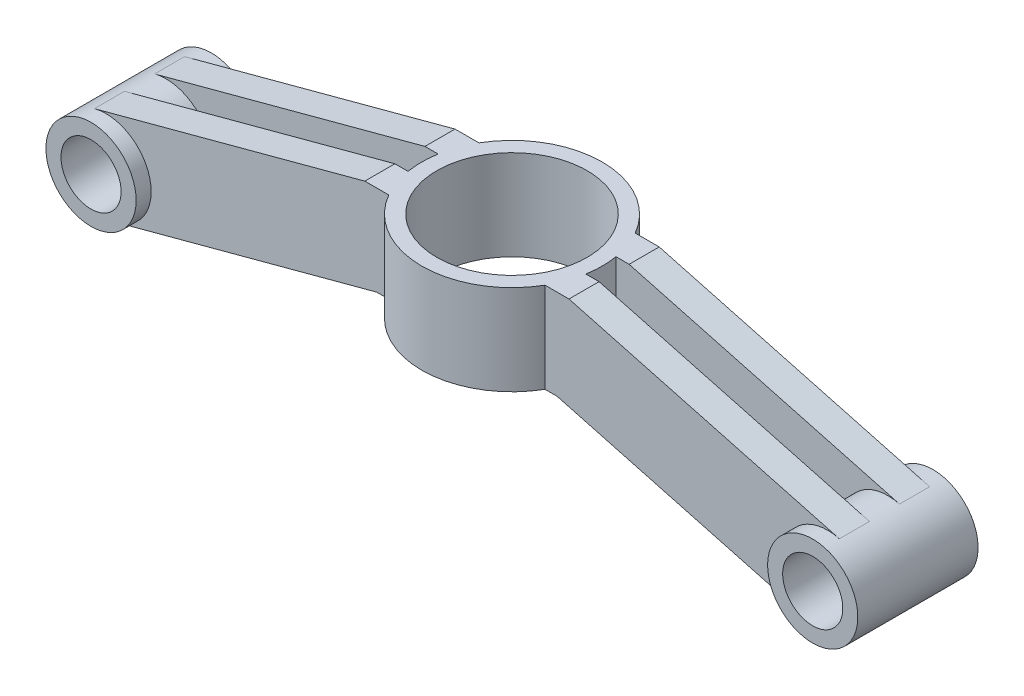
ISO-10303-21;
HEADER;
FILE_DESCRIPTION(('STEP AP214'),'2;1');
FILE_NAME('part.step','',(''),(''),'','','');
FILE_SCHEMA(('AUTOMOTIVE_DESIGN { 1 0 10303 214 1 1 1 1 }'));
ENDSEC;
DATA;
#1=APPLICATION_CONTEXT('core data for automotive mechanical design processes');
#2=APPLICATION_PROTOCOL_DEFINITION('international standard','automotive_design',2000,#1);
#3=PRODUCT_CONTEXT('',#1,'mechanical');
#4=PRODUCT('Part','Part','',(#3));
#5=PRODUCT_RELATED_PRODUCT_CATEGORY('part','',(#4));
#6=PRODUCT_DEFINITION_FORMATION('','',#4);
#7=PRODUCT_DEFINITION_CONTEXT('part definition',#1,'design');
#8=PRODUCT_DEFINITION('design','',#6,#7);
#9=PRODUCT_DEFINITION_SHAPE('','',#8);
#10=(LENGTH_UNIT() NAMED_UNIT(*) SI_UNIT(.MILLI.,.METRE.));
#11=(NAMED_UNIT(*) PLANE_ANGLE_UNIT() SI_UNIT($,.RADIAN.));
#12=(NAMED_UNIT(*) SI_UNIT($,.STERADIAN.) SOLID_ANGLE_UNIT());
#13=UNCERTAINTY_MEASURE_WITH_UNIT(LENGTH_MEASURE(1.E-05),#10,'distance_accuracy_value','');
#14=(GEOMETRIC_REPRESENTATION_CONTEXT(3) GLOBAL_UNCERTAINTY_ASSIGNED_CONTEXT((#13)) GLOBAL_UNIT_ASSIGNED_CONTEXT((#10,
#11,#12)) REPRESENTATION_CONTEXT('',''));
#15=CARTESIAN_POINT('',(0.,0.,0.));
#16=DIRECTION('',(0.,0.,1.));
#17=DIRECTION('',(1.,0.,0.));
#18=AXIS2_PLACEMENT_3D('',#15,#16,#17);
#19=CARTESIAN_POINT('',(0.,38.5862846126499,-15.));
#20=DIRECTION('',(0.,1.,0.));
#21=DIRECTION('',(0.,0.,1.));
#22=AXIS2_PLACEMENT_3D('',#19,#20,#21);
#23=PLANE('',#22);
#24=DIRECTION('',(-1.,0.,0.));
#25=VECTOR('',#24,1.);
#26=CARTESIAN_POINT('',(0.,38.5862846126499,-5.));
#27=LINE('',#26,#25);
#28=CARTESIAN_POINT('',(-25.9807621135332,38.5862846126499,-5.));
#29=VERTEX_POINT('',#28);
#30=CARTESIAN_POINT('',(-33.9495749276219,38.5862846126499,-5.));
#31=VERTEX_POINT('',#30);
#32=EDGE_CURVE('E222',#29,#31,#27,.T.);
#33=ORIENTED_EDGE('',*,*,#32,.F.);
#34=CARTESIAN_POINT('',(0.,38.5862846126499,-20.));
#35=DIRECTION('',(0.,1.,0.));
#36=DIRECTION('',(0.,0.,1.));
#37=AXIS2_PLACEMENT_3D('',#34,#35,#36);
#38=CIRCLE('',#37,30.);
#39=CARTESIAN_POINT('',(25.9807621135332,38.5862846126499,-5.));
#40=VERTEX_POINT('',#39);
#41=EDGE_CURVE('E205',#29,#40,#38,.T.);
#42=ORIENTED_EDGE('',*,*,#41,.T.);
#43=CARTESIAN_POINT('',(33.9495749276219,38.5862846126499,-5.));
#44=VERTEX_POINT('',#43);
#45=EDGE_CURVE('E219',#44,#40,#27,.T.);
#46=ORIENTED_EDGE('',*,*,#45,.F.);
#47=DIRECTION('',(0.,0.,1.));
#48=VECTOR('',#47,1.);
#49=CARTESIAN_POINT('',(33.9495749276219,38.5862846126499,-15.));
#50=LINE('',#49,#48);
#51=CARTESIAN_POINT('',(33.9495749276219,38.5862846126499,-15.));
#52=VERTEX_POINT('',#51);
#53=EDGE_CURVE('E375',#52,#44,#50,.T.);
#54=ORIENTED_EDGE('',*,*,#53,.F.);
#55=DIRECTION('',(-1.,0.,0.));
#56=VECTOR('',#55,1.);
#57=CARTESIAN_POINT('',(0.,38.5862846126499,-15.));
#58=LINE('',#57,#56);
#59=CARTESIAN_POINT('',(29.5803989154981,38.5862846126499,-15.));
#60=VERTEX_POINT('',#59);
#61=EDGE_CURVE('E342',#52,#60,#58,.T.);
#62=ORIENTED_EDGE('',*,*,#61,.T.);
#63=CARTESIAN_POINT('',(29.5803989154981,38.5862846126499,-25.));
#64=VERTEX_POINT('',#63);
#65=EDGE_CURVE('E227',#60,#64,#38,.T.);
#66=ORIENTED_EDGE('',*,*,#65,.T.);
#67=DIRECTION('',(-1.,0.,0.));
#68=VECTOR('',#67,1.);
#69=CARTESIAN_POINT('',(0.,38.5862846126499,-25.));
#70=LINE('',#69,#68);
#71=CARTESIAN_POINT('',(33.9495749276219,38.5862846126499,-25.));
#72=VERTEX_POINT('',#71);
#73=EDGE_CURVE('E316',#72,#64,#70,.T.);
#74=ORIENTED_EDGE('',*,*,#73,.F.);
#75=DIRECTION('',(0.,0.,1.));
#76=VECTOR('',#75,1.);
#77=CARTESIAN_POINT('',(33.9495749276219,38.5862846126499,-35.));
#78=LINE('',#77,#76);
#79=CARTESIAN_POINT('',(33.9495749276219,38.5862846126499,-35.));
#80=VERTEX_POINT('',#79);
#81=EDGE_CURVE('E494',#80,#72,#78,.T.);
#82=ORIENTED_EDGE('',*,*,#81,.F.);
#83=DIRECTION('',(-1.,0.,0.));
#84=VECTOR('',#83,1.);
#85=CARTESIAN_POINT('',(0.,38.5862846126499,-35.));
#86=LINE('',#85,#84);
#87=CARTESIAN_POINT('',(25.9807621135332,38.5862846126499,-35.));
#88=VERTEX_POINT('',#87);
#89=EDGE_CURVE('E423',#80,#88,#86,.T.);
#90=ORIENTED_EDGE('',*,*,#89,.T.);
#91=CARTESIAN_POINT('',(-25.9807621135332,38.5862846126499,-35.));
#92=VERTEX_POINT('',#91);
#93=EDGE_CURVE('E537',#88,#92,#38,.T.);
#94=ORIENTED_EDGE('',*,*,#93,.T.);
#95=CARTESIAN_POINT('',(-33.9495749276219,38.5862846126499,-35.));
#96=VERTEX_POINT('',#95);
#97=EDGE_CURVE('E422',#92,#96,#86,.T.);
#98=ORIENTED_EDGE('',*,*,#97,.T.);
#99=DIRECTION('',(0.,0.,1.));
#100=VECTOR('',#99,1.);
#101=CARTESIAN_POINT('',(-33.9495749276219,38.5862846126499,-35.));
#102=LINE('',#101,#100);
#103=CARTESIAN_POINT('',(-33.9495749276219,38.5862846126499,-25.));
#104=VERTEX_POINT('',#103);
#105=EDGE_CURVE('E331',#96,#104,#102,.T.);
#106=ORIENTED_EDGE('',*,*,#105,.T.);
#107=CARTESIAN_POINT('',(-29.5803989154981,38.5862846126499,-25.));
#108=VERTEX_POINT('',#107);
#109=EDGE_CURVE('E311',#108,#104,#70,.T.);
#110=ORIENTED_EDGE('',*,*,#109,.F.);
#111=CARTESIAN_POINT('',(-29.5803989154981,38.5862846126499,-15.));
#112=VERTEX_POINT('',#111);
#113=EDGE_CURVE('E224',#108,#112,#38,.T.);
#114=ORIENTED_EDGE('',*,*,#113,.T.);
#115=CARTESIAN_POINT('',(-33.9495749276219,38.5862846126499,-15.));
#116=VERTEX_POINT('',#115);
#117=EDGE_CURVE('E257',#112,#116,#58,.T.);
#118=ORIENTED_EDGE('',*,*,#117,.T.);
#119=DIRECTION('',(0.,0.,1.));
#120=VECTOR('',#119,1.);
#121=CARTESIAN_POINT('',(-33.9495749276219,38.5862846126499,-15.));
#122=LINE('',#121,#120);
#123=EDGE_CURVE('E269',#116,#31,#122,.T.);
#124=ORIENTED_EDGE('',*,*,#123,.T.);
#125=EDGE_LOOP('',(#33,#42,#46,#54,#62,#66,#74,#82,#90,#94,#98,#106,#110,#114,#118,#124));
#126=FACE_BOUND('',#125,.T.);
#127=CARTESIAN_POINT('',(0.,38.5862846126499,-20.));
#128=DIRECTION('',(0.,1.,0.));
#129=DIRECTION('',(0.,0.,1.));
#130=AXIS2_PLACEMENT_3D('',#127,#128,#129);
#131=CIRCLE('',#130,25.);
#132=CARTESIAN_POINT('',(0.,38.5862846126499,5.));
#133=VERTEX_POINT('',#132);
#134=EDGE_CURVE('E539',#133,#133,#131,.T.);
#135=ORIENTED_EDGE('',*,*,#134,.F.);
#136=EDGE_LOOP('',(#135));
#137=FACE_BOUND('',#136,.T.);
#138=ADVANCED_FACE('F41',(#126,#137),#23,.T.);
#139=CARTESIAN_POINT('',(0.,8.58628461264989,-15.));
#140=DIRECTION('',(0.,-1.,0.));
#141=DIRECTION('',(1.,0.,0.));
#142=AXIS2_PLACEMENT_3D('',#139,#140,#141);
#143=PLANE('',#142);
#144=DIRECTION('',(1.,0.,0.));
#145=VECTOR('',#144,1.);
#146=CARTESIAN_POINT('',(0.,8.58628461264989,-15.));
#147=LINE('',#146,#145);
#148=CARTESIAN_POINT('',(-30.,8.58628461264989,-15.));
#149=VERTEX_POINT('',#148);
#150=CARTESIAN_POINT('',(-29.5803989154981,8.58628461264989,-15.));
#151=VERTEX_POINT('',#150);
#152=EDGE_CURVE('E242',#149,#151,#147,.T.);
#153=ORIENTED_EDGE('',*,*,#152,.T.);
#154=CARTESIAN_POINT('',(0.,8.58628461264989,-20.));
#155=DIRECTION('',(0.,1.,0.));
#156=DIRECTION('',(0.,0.,1.));
#157=AXIS2_PLACEMENT_3D('',#154,#155,#156);
#158=CIRCLE('',#157,30.);
#159=CARTESIAN_POINT('',(-29.5803989154981,8.58628461264989,-25.));
#160=VERTEX_POINT('',#159);
#161=EDGE_CURVE('E292',#160,#151,#158,.T.);
#162=ORIENTED_EDGE('',*,*,#161,.F.);
#163=DIRECTION('',(1.,0.,0.));
#164=VECTOR('',#163,1.);
#165=CARTESIAN_POINT('',(-30.,8.58628461264989,-25.));
#166=LINE('',#165,#164);
#167=CARTESIAN_POINT('',(-30.,8.58628461264989,-25.));
#168=VERTEX_POINT('',#167);
#169=EDGE_CURVE('E301',#168,#160,#166,.T.);
#170=ORIENTED_EDGE('',*,*,#169,.F.);
#171=DIRECTION('',(0.,0.,1.));
#172=VECTOR('',#171,1.);
#173=CARTESIAN_POINT('',(-30.,8.58628461264989,-35.));
#174=LINE('',#173,#172);
#175=CARTESIAN_POINT('',(-30.,8.58628461264989,-35.));
#176=VERTEX_POINT('',#175);
#177=EDGE_CURVE('E335',#176,#168,#174,.T.);
#178=ORIENTED_EDGE('',*,*,#177,.F.);
#179=DIRECTION('',(1.,0.,0.));
#180=VECTOR('',#179,1.);
#181=CARTESIAN_POINT('',(-30.,8.58628461264989,-35.));
#182=LINE('',#181,#180);
#183=CARTESIAN_POINT('',(-25.9807621135332,8.58628461264989,-35.));
#184=VERTEX_POINT('',#183);
#185=EDGE_CURVE('E418',#176,#184,#182,.T.);
#186=ORIENTED_EDGE('',*,*,#185,.T.);
#187=CARTESIAN_POINT('',(25.9807621135332,8.58628461264989,-35.));
#188=VERTEX_POINT('',#187);
#189=EDGE_CURVE('E304',#188,#184,#158,.T.);
#190=ORIENTED_EDGE('',*,*,#189,.F.);
#191=CARTESIAN_POINT('',(30.,8.58628461264989,-35.));
#192=VERTEX_POINT('',#191);
#193=EDGE_CURVE('E417',#188,#192,#182,.T.);
#194=ORIENTED_EDGE('',*,*,#193,.T.);
#195=DIRECTION('',(0.,0.,1.));
#196=VECTOR('',#195,1.);
#197=CARTESIAN_POINT('',(30.,8.58628461264989,-35.));
#198=LINE('',#197,#196);
#199=CARTESIAN_POINT('',(30.,8.58628461264989,-25.));
#200=VERTEX_POINT('',#199);
#201=EDGE_CURVE('E498',#192,#200,#198,.T.);
#202=ORIENTED_EDGE('',*,*,#201,.T.);
#203=CARTESIAN_POINT('',(29.5803989154981,8.58628461264989,-25.));
#204=VERTEX_POINT('',#203);
#205=EDGE_CURVE('E312',#204,#200,#166,.T.);
#206=ORIENTED_EDGE('',*,*,#205,.F.);
#207=CARTESIAN_POINT('',(29.5803989154981,8.58628461264989,-15.));
#208=VERTEX_POINT('',#207);
#209=EDGE_CURVE('E365',#208,#204,#158,.T.);
#210=ORIENTED_EDGE('',*,*,#209,.F.);
#211=CARTESIAN_POINT('',(30.,8.58628461264989,-15.));
#212=VERTEX_POINT('',#211);
#213=EDGE_CURVE('E57',#208,#212,#147,.T.);
#214=ORIENTED_EDGE('',*,*,#213,.T.);
#215=DIRECTION('',(0.,0.,1.));
#216=VECTOR('',#215,1.);
#217=CARTESIAN_POINT('',(30.,8.58628461264989,-15.));
#218=LINE('',#217,#216);
#219=CARTESIAN_POINT('',(30.,8.58628461264989,-5.));
#220=VERTEX_POINT('',#219);
#221=EDGE_CURVE('E363',#212,#220,#218,.T.);
#222=ORIENTED_EDGE('',*,*,#221,.T.);
#223=DIRECTION('',(1.,0.,0.));
#224=VECTOR('',#223,1.);
#225=CARTESIAN_POINT('',(0.,8.58628461264989,-5.));
#226=LINE('',#225,#224);
#227=CARTESIAN_POINT('',(25.9807621135332,8.58628461264989,-5.));
#228=VERTEX_POINT('',#227);
#229=EDGE_CURVE('E252',#228,#220,#226,.T.);
#230=ORIENTED_EDGE('',*,*,#229,.F.);
#231=CARTESIAN_POINT('',(-25.9807621135332,8.58628461264989,-5.));
#232=VERTEX_POINT('',#231);
#233=EDGE_CURVE('E208',#232,#228,#158,.T.);
#234=ORIENTED_EDGE('',*,*,#233,.F.);
#235=CARTESIAN_POINT('',(-30.,8.58628461264989,-5.));
#236=VERTEX_POINT('',#235);
#237=EDGE_CURVE('E253',#236,#232,#226,.T.);
#238=ORIENTED_EDGE('',*,*,#237,.F.);
#239=DIRECTION('',(0.,0.,1.));
#240=VECTOR('',#239,1.);
#241=CARTESIAN_POINT('',(-30.,8.58628461264989,-15.));
#242=LINE('',#241,#240);
#243=EDGE_CURVE('E258',#149,#236,#242,.T.);
#244=ORIENTED_EDGE('',*,*,#243,.F.);
#245=EDGE_LOOP('',(#153,#162,#170,#178,#186,#190,#194,#202,#206,#210,#214,#222,#230,#234,#238,#244));
#246=FACE_BOUND('',#245,.T.);
#247=CARTESIAN_POINT('',(0.,8.58628461264989,-20.));
#248=DIRECTION('',(0.,1.,0.));
#249=DIRECTION('',(0.,0.,1.));
#250=AXIS2_PLACEMENT_3D('',#247,#248,#249);
#251=CIRCLE('',#250,25.);
#252=CARTESIAN_POINT('',(0.,8.58628461264989,5.));
#253=VERTEX_POINT('',#252);
#254=EDGE_CURVE('E225',#253,#253,#251,.T.);
#255=ORIENTED_EDGE('',*,*,#254,.T.);
#256=EDGE_LOOP('',(#255));
#257=FACE_BOUND('',#256,.T.);
#258=ADVANCED_FACE('F299',(#246,#257),#143,.T.);
#259=CARTESIAN_POINT('',(-120.,0.,-15.));
#260=DIRECTION('',(0.,0.,1.));
#261=DIRECTION('',(1.,0.,0.));
#262=AXIS2_PLACEMENT_3D('',#259,#260,#261);
#263=PLANE('',#262);
#264=ORIENTED_EDGE('',*,*,#213,.F.);
#265=DIRECTION('',(0.,1.,0.));
#266=VECTOR('',#265,1.);
#267=CARTESIAN_POINT('',(29.5803989154981,8.58628461264989,-15.));
#268=LINE('',#267,#266);
#269=EDGE_CURVE('E464',#208,#60,#268,.T.);
#270=ORIENTED_EDGE('',*,*,#269,.T.);
#271=ORIENTED_EDGE('',*,*,#61,.F.);
#272=DIRECTION('',(0.965925826289068,-0.258819045102522,0.));
#273=VECTOR('',#272,1.);
#274=CARTESIAN_POINT('',(33.9495749276219,38.5862846126499,-15.));
#275=LINE('',#274,#273);
#276=CARTESIAN_POINT('',(123.882285676538,14.488887394336,-15.));
#277=VERTEX_POINT('',#276);
#278=EDGE_CURVE('E505',#52,#277,#275,.T.);
#279=ORIENTED_EDGE('',*,*,#278,.T.);
#280=CARTESIAN_POINT('',(120.,0.,-15.));
#281=DIRECTION('',(0.,0.,1.));
#282=DIRECTION('',(-1.,0.,0.));
#283=AXIS2_PLACEMENT_3D('',#280,#281,#282);
#284=CIRCLE('',#283,15.);
#285=CARTESIAN_POINT('',(116.117714323462,-14.488887394336,-15.));
#286=VERTEX_POINT('',#285);
#287=EDGE_CURVE('E370',#277,#286,#284,.T.);
#288=ORIENTED_EDGE('',*,*,#287,.T.);
#289=DIRECTION('',(-0.965925826289068,0.258819045102522,0.));
#290=VECTOR('',#289,1.);
#291=CARTESIAN_POINT('',(30.,8.58628461264989,-15.));
#292=LINE('',#291,#290);
#293=EDGE_CURVE('E367',#286,#212,#292,.T.);
#294=ORIENTED_EDGE('',*,*,#293,.T.);
#295=EDGE_LOOP('',(#264,#270,#271,#279,#288,#294));
#296=FACE_BOUND('',#295,.T.);
#297=ADVANCED_FACE('F368',(#296),#263,.F.);
#298=CARTESIAN_POINT('',(-120.,0.,-5.));
#299=DIRECTION('',(0.,0.,1.));
#300=DIRECTION('',(1.,0.,0.));
#301=AXIS2_PLACEMENT_3D('',#298,#299,#300);
#302=PLANE('',#301);
#303=DIRECTION('',(0.,1.,0.));
#304=VECTOR('',#303,1.);
#305=CARTESIAN_POINT('',(25.9807621135332,8.58628461264989,-5.));
#306=LINE('',#305,#304);
#307=EDGE_CURVE('E202',#228,#40,#306,.T.);
#308=ORIENTED_EDGE('',*,*,#307,.F.);
#309=ORIENTED_EDGE('',*,*,#229,.T.);
#310=DIRECTION('',(-0.965925826289068,0.258819045102522,0.));
#311=VECTOR('',#310,1.);
#312=CARTESIAN_POINT('',(30.,8.58628461264989,-5.));
#313=LINE('',#312,#311);
#314=CARTESIAN_POINT('',(116.117714323462,-14.488887394336,-5.));
#315=VERTEX_POINT('',#314);
#316=EDGE_CURVE('E379',#315,#220,#313,.T.);
#317=ORIENTED_EDGE('',*,*,#316,.F.);
#318=CARTESIAN_POINT('',(120.,0.,-5.));
#319=DIRECTION('',(0.,0.,1.));
#320=DIRECTION('',(-1.,0.,0.));
#321=AXIS2_PLACEMENT_3D('',#318,#319,#320);
#322=CIRCLE('',#321,15.);
#323=CARTESIAN_POINT('',(123.882285676538,14.488887394336,-5.));
#324=VERTEX_POINT('',#323);
#325=EDGE_CURVE('E511',#324,#315,#322,.T.);
#326=ORIENTED_EDGE('',*,*,#325,.F.);
#327=DIRECTION('',(0.965925826289068,-0.258819045102522,0.));
#328=VECTOR('',#327,1.);
#329=CARTESIAN_POINT('',(33.9495749276219,38.5862846126499,-5.));
#330=LINE('',#329,#328);
#331=EDGE_CURVE('E230',#44,#324,#330,.T.);
#332=ORIENTED_EDGE('',*,*,#331,.F.);
#333=ORIENTED_EDGE('',*,*,#45,.T.);
#334=EDGE_LOOP('',(#308,#309,#317,#326,#332,#333));
#335=FACE_BOUND('',#334,.T.);
#336=ADVANCED_FACE('F228',(#335),#302,.T.);
#337=CARTESIAN_POINT('',(-120.,0.,-35.));
#338=DIRECTION('',(0.,0.,1.));
#339=DIRECTION('',(1.,0.,0.));
#340=AXIS2_PLACEMENT_3D('',#337,#338,#339);
#341=PLANE('',#340);
#342=ORIENTED_EDGE('',*,*,#193,.F.);
#343=DIRECTION('',(0.,1.,0.));
#344=VECTOR('',#343,1.);
#345=CARTESIAN_POINT('',(25.9807621135332,8.58628461264989,-35.));
#346=LINE('',#345,#344);
#347=EDGE_CURVE('E454',#188,#88,#346,.T.);
#348=ORIENTED_EDGE('',*,*,#347,.T.);
#349=ORIENTED_EDGE('',*,*,#89,.F.);
#350=DIRECTION('',(0.965925826289068,-0.258819045102522,0.));
#351=VECTOR('',#350,1.);
#352=CARTESIAN_POINT('',(33.9495749276219,38.5862846126499,-35.));
#353=LINE('',#352,#351);
#354=CARTESIAN_POINT('',(123.882285676538,14.488887394336,-35.));
#355=VERTEX_POINT('',#354);
#356=EDGE_CURVE('E477',#80,#355,#353,.T.);
#357=ORIENTED_EDGE('',*,*,#356,.T.);
#358=CARTESIAN_POINT('',(120.,0.,-35.));
#359=DIRECTION('',(0.,0.,1.));
#360=DIRECTION('',(-1.,0.,0.));
#361=AXIS2_PLACEMENT_3D('',#358,#359,#360);
#362=CIRCLE('',#361,15.);
#363=CARTESIAN_POINT('',(116.117714323462,-14.488887394336,-35.));
#364=VERTEX_POINT('',#363);
#365=EDGE_CURVE('E468',#355,#364,#362,.T.);
#366=ORIENTED_EDGE('',*,*,#365,.T.);
#367=DIRECTION('',(-0.965925826289068,0.258819045102522,0.));
#368=VECTOR('',#367,1.);
#369=CARTESIAN_POINT('',(116.117714323462,-14.488887394336,-35.));
#370=LINE('',#369,#368);
#371=EDGE_CURVE('E472',#364,#192,#370,.T.);
#372=ORIENTED_EDGE('',*,*,#371,.T.);
#373=EDGE_LOOP('',(#342,#348,#349,#357,#366,#372));
#374=FACE_BOUND('',#373,.T.);
#375=ADVANCED_FACE('F580',(#374),#341,.F.);
#376=CARTESIAN_POINT('',(-120.,0.,-25.));
#377=DIRECTION('',(0.,0.,1.));
#378=DIRECTION('',(1.,0.,0.));
#379=AXIS2_PLACEMENT_3D('',#376,#377,#378);
#380=PLANE('',#379);
#381=DIRECTION('',(0.,1.,0.));
#382=VECTOR('',#381,1.);
#383=CARTESIAN_POINT('',(29.5803989154981,8.58628461264989,-25.));
#384=LINE('',#383,#382);
#385=EDGE_CURVE('E11',#204,#64,#384,.T.);
#386=ORIENTED_EDGE('',*,*,#385,.F.);
#387=ORIENTED_EDGE('',*,*,#205,.T.);
#388=DIRECTION('',(-0.965925826289068,0.258819045102522,0.));
#389=VECTOR('',#388,1.);
#390=CARTESIAN_POINT('',(116.117714323462,-14.488887394336,-25.));
#391=LINE('',#390,#389);
#392=CARTESIAN_POINT('',(116.117714323462,-14.488887394336,-25.));
#393=VERTEX_POINT('',#392);
#394=EDGE_CURVE('E484',#393,#200,#391,.T.);
#395=ORIENTED_EDGE('',*,*,#394,.F.);
#396=CARTESIAN_POINT('',(120.,0.,-25.));
#397=DIRECTION('',(0.,0.,1.));
#398=DIRECTION('',(-1.,0.,0.));
#399=AXIS2_PLACEMENT_3D('',#396,#397,#398);
#400=CIRCLE('',#399,15.);
#401=CARTESIAN_POINT('',(123.882285676538,14.488887394336,-25.));
#402=VERTEX_POINT('',#401);
#403=EDGE_CURVE('E467',#402,#393,#400,.T.);
#404=ORIENTED_EDGE('',*,*,#403,.F.);
#405=DIRECTION('',(0.965925826289068,-0.258819045102522,0.));
#406=VECTOR('',#405,1.);
#407=CARTESIAN_POINT('',(33.9495749276219,38.5862846126499,-25.));
#408=LINE('',#407,#406);
#409=EDGE_CURVE('E473',#72,#402,#408,.T.);
#410=ORIENTED_EDGE('',*,*,#409,.F.);
#411=ORIENTED_EDGE('',*,*,#73,.T.);
#412=EDGE_LOOP('',(#386,#387,#395,#404,#410,#411));
#413=FACE_BOUND('',#412,.T.);
#414=ADVANCED_FACE('F571',(#413),#380,.T.);
#415=CARTESIAN_POINT('',(-120.,0.,-40.));
#416=DIRECTION('',(0.,0.,1.));
#417=DIRECTION('',(1.,0.,0.));
#418=AXIS2_PLACEMENT_3D('',#415,#416,#417);
#419=CYLINDRICAL_SURFACE('',#418,15.);
#420=CARTESIAN_POINT('',(-120.,0.,-40.));
#421=DIRECTION('',(0.,0.,1.));
#422=DIRECTION('',(1.,0.,0.));
#423=AXIS2_PLACEMENT_3D('',#420,#421,#422);
#424=CIRCLE('',#423,15.);
#425=CARTESIAN_POINT('',(-105.,0.,-40.));
#426=VERTEX_POINT('',#425);
#427=EDGE_CURVE('E276',#426,#426,#424,.T.);
#428=ORIENTED_EDGE('',*,*,#427,.T.);
#429=EDGE_LOOP('',(#428));
#430=FACE_BOUND('',#429,.T.);
#431=CARTESIAN_POINT('',(-120.,0.,0.));
#432=DIRECTION('',(0.,0.,1.));
#433=DIRECTION('',(1.,0.,0.));
#434=AXIS2_PLACEMENT_3D('',#431,#432,#433);
#435=CIRCLE('',#434,15.);
#436=CARTESIAN_POINT('',(-105.,0.,0.));
#437=VERTEX_POINT('',#436);
#438=EDGE_CURVE('E277',#437,#437,#435,.T.);
#439=ORIENTED_EDGE('',*,*,#438,.F.);
#440=EDGE_LOOP('',(#439));
#441=FACE_BOUND('',#440,.T.);
#442=DIRECTION('',(0.,0.,1.));
#443=VECTOR('',#442,1.);
#444=CARTESIAN_POINT('',(-123.882285676538,14.488887394336,-15.));
#445=LINE('',#444,#443);
#446=CARTESIAN_POINT('',(-123.882285676538,14.488887394336,-15.));
#447=VERTEX_POINT('',#446);
#448=CARTESIAN_POINT('',(-123.882285676538,14.488887394336,-5.));
#449=VERTEX_POINT('',#448);
#450=EDGE_CURVE('E265',#447,#449,#445,.T.);
#451=ORIENTED_EDGE('',*,*,#450,.F.);
#452=CARTESIAN_POINT('',(-120.,0.,-15.));
#453=DIRECTION('',(0.,0.,-1.));
#454=DIRECTION('',(1.,0.,0.));
#455=AXIS2_PLACEMENT_3D('',#452,#453,#454);
#456=CIRCLE('',#455,15.);
#457=CARTESIAN_POINT('',(-116.117714323462,-14.488887394336,-15.));
#458=VERTEX_POINT('',#457);
#459=EDGE_CURVE('E350',#447,#458,#456,.T.);
#460=ORIENTED_EDGE('',*,*,#459,.T.);
#461=DIRECTION('',(0.,0.,1.));
#462=VECTOR('',#461,1.);
#463=CARTESIAN_POINT('',(-116.117714323462,-14.488887394336,-15.));
#464=LINE('',#463,#462);
#465=CARTESIAN_POINT('',(-116.117714323462,-14.488887394336,-5.));
#466=VERTEX_POINT('',#465);
#467=EDGE_CURVE('E262',#458,#466,#464,.T.);
#468=ORIENTED_EDGE('',*,*,#467,.T.);
#469=CARTESIAN_POINT('',(-120.,0.,-5.));
#470=DIRECTION('',(0.,0.,-1.));
#471=DIRECTION('',(1.,0.,0.));
#472=AXIS2_PLACEMENT_3D('',#469,#470,#471);
#473=CIRCLE('',#472,15.);
#474=EDGE_CURVE('E238',#449,#466,#473,.T.);
#475=ORIENTED_EDGE('',*,*,#474,.F.);
#476=EDGE_LOOP('',(#451,#460,#468,#475));
#477=FACE_BOUND('',#476,.T.);
#478=DIRECTION('',(0.,0.,1.));
#479=VECTOR('',#478,1.);
#480=CARTESIAN_POINT('',(-123.882285676538,14.488887394336,-35.));
#481=LINE('',#480,#479);
#482=CARTESIAN_POINT('',(-123.882285676538,14.488887394336,-35.));
#483=VERTEX_POINT('',#482);
#484=CARTESIAN_POINT('',(-123.882285676538,14.488887394336,-25.));
#485=VERTEX_POINT('',#484);
#486=EDGE_CURVE('E240',#483,#485,#481,.T.);
#487=ORIENTED_EDGE('',*,*,#486,.F.);
#488=CARTESIAN_POINT('',(-120.,0.,-35.));
#489=DIRECTION('',(0.,0.,-1.));
#490=DIRECTION('',(1.,0.,0.));
#491=AXIS2_PLACEMENT_3D('',#488,#489,#490);
#492=CIRCLE('',#491,15.);
#493=CARTESIAN_POINT('',(-116.117714323462,-14.488887394336,-35.));
#494=VERTEX_POINT('',#493);
#495=EDGE_CURVE('E327',#483,#494,#492,.T.);
#496=ORIENTED_EDGE('',*,*,#495,.T.);
#497=DIRECTION('',(0.,0.,1.));
#498=VECTOR('',#497,1.);
#499=CARTESIAN_POINT('',(-116.117714323462,-14.488887394336,-35.));
#500=LINE('',#499,#498);
#501=CARTESIAN_POINT('',(-116.117714323462,-14.488887394336,-25.));
#502=VERTEX_POINT('',#501);
#503=EDGE_CURVE('E338',#494,#502,#500,.T.);
#504=ORIENTED_EDGE('',*,*,#503,.T.);
#505=CARTESIAN_POINT('',(-120.,0.,-25.));
#506=DIRECTION('',(0.,0.,-1.));
#507=DIRECTION('',(1.,0.,0.));
#508=AXIS2_PLACEMENT_3D('',#505,#506,#507);
#509=CIRCLE('',#508,15.);
#510=EDGE_CURVE('E406',#485,#502,#509,.T.);
#511=ORIENTED_EDGE('',*,*,#510,.F.);
#512=EDGE_LOOP('',(#487,#496,#504,#511));
#513=FACE_BOUND('',#512,.T.);
#514=ADVANCED_FACE('F433',(#430,#441,#477,#513),#419,.T.);
#515=CARTESIAN_POINT('',(-120.,0.,-40.));
#516=DIRECTION('',(0.,0.,1.));
#517=DIRECTION('',(1.,0.,0.));
#518=AXIS2_PLACEMENT_3D('',#515,#516,#517);
#519=CYLINDRICAL_SURFACE('',#518,9.99999999999999);
#520=CARTESIAN_POINT('',(-120.,0.,-40.));
#521=DIRECTION('',(0.,0.,1.));
#522=DIRECTION('',(1.,0.,0.));
#523=AXIS2_PLACEMENT_3D('',#520,#521,#522);
#524=CIRCLE('',#523,9.99999999999999);
#525=CARTESIAN_POINT('',(-110.,0.,-40.));
#526=VERTEX_POINT('',#525);
#527=EDGE_CURVE('E272',#526,#526,#524,.T.);
#528=ORIENTED_EDGE('',*,*,#527,.F.);
#529=EDGE_LOOP('',(#528));
#530=FACE_BOUND('',#529,.T.);
#531=CARTESIAN_POINT('',(-120.,0.,0.));
#532=DIRECTION('',(0.,0.,1.));
#533=DIRECTION('',(1.,0.,0.));
#534=AXIS2_PLACEMENT_3D('',#531,#532,#533);
#535=CIRCLE('',#534,9.99999999999999);
#536=CARTESIAN_POINT('',(-110.,0.,0.));
#537=VERTEX_POINT('',#536);
#538=EDGE_CURVE('E261',#537,#537,#535,.T.);
#539=ORIENTED_EDGE('',*,*,#538,.T.);
#540=EDGE_LOOP('',(#539));
#541=FACE_BOUND('',#540,.T.);
#542=ADVANCED_FACE('F43',(#530,#541),#519,.F.);
#543=CARTESIAN_POINT('',(0.,0.,-40.));
#544=DIRECTION('',(0.,0.,1.));
#545=DIRECTION('',(1.,0.,0.));
#546=AXIS2_PLACEMENT_3D('',#543,#544,#545);
#547=PLANE('',#546);
#548=ORIENTED_EDGE('',*,*,#527,.T.);
#549=EDGE_LOOP('',(#548));
#550=FACE_BOUND('',#549,.T.);
#551=ORIENTED_EDGE('',*,*,#427,.F.);
#552=EDGE_LOOP('',(#551));
#553=FACE_BOUND('',#552,.T.);
#554=ADVANCED_FACE('F563',(#550,#553),#547,.F.);
#555=CARTESIAN_POINT('',(0.,0.,0.));
#556=DIRECTION('',(0.,0.,1.));
#557=DIRECTION('',(1.,0.,0.));
#558=AXIS2_PLACEMENT_3D('',#555,#556,#557);
#559=PLANE('',#558);
#560=ORIENTED_EDGE('',*,*,#538,.F.);
#561=EDGE_LOOP('',(#560));
#562=FACE_BOUND('',#561,.T.);
#563=ORIENTED_EDGE('',*,*,#438,.T.);
#564=EDGE_LOOP('',(#563));
#565=FACE_BOUND('',#564,.T.);
#566=ADVANCED_FACE('F566',(#562,#565),#559,.T.);
#567=CARTESIAN_POINT('',(-30.,8.58628461264989,-15.));
#568=DIRECTION('',(0.258819045102522,-0.965925826289068,0.));
#569=DIRECTION('',(0.965925826289068,0.258819045102522,0.));
#570=AXIS2_PLACEMENT_3D('',#567,#568,#569);
#571=PLANE('',#570);
#572=DIRECTION('',(0.965925826289068,0.258819045102522,0.));
#573=VECTOR('',#572,1.);
#574=CARTESIAN_POINT('',(-30.,8.58628461264989,-5.));
#575=LINE('',#574,#573);
#576=EDGE_CURVE('E248',#466,#236,#575,.T.);
#577=ORIENTED_EDGE('',*,*,#576,.F.);
#578=ORIENTED_EDGE('',*,*,#467,.F.);
#579=DIRECTION('',(0.965925826289068,0.258819045102522,0.));
#580=VECTOR('',#579,1.);
#581=CARTESIAN_POINT('',(-30.,8.58628461264989,-15.));
#582=LINE('',#581,#580);
#583=EDGE_CURVE('E352',#458,#149,#582,.T.);
#584=ORIENTED_EDGE('',*,*,#583,.T.);
#585=ORIENTED_EDGE('',*,*,#243,.T.);
#586=EDGE_LOOP('',(#577,#578,#584,#585));
#587=FACE_BOUND('',#586,.T.);
#588=ADVANCED_FACE('F530',(#587),#571,.T.);
#589=CARTESIAN_POINT('',(-33.9495749276219,38.5862846126499,-15.));
#590=DIRECTION('',(-0.258819045102522,0.965925826289068,0.));
#591=DIRECTION('',(-0.965925826289068,-0.258819045102522,0.));
#592=AXIS2_PLACEMENT_3D('',#589,#590,#591);
#593=PLANE('',#592);
#594=DIRECTION('',(-0.965925826289068,-0.258819045102522,0.));
#595=VECTOR('',#594,1.);
#596=CARTESIAN_POINT('',(-33.9495749276219,38.5862846126499,-5.));
#597=LINE('',#596,#595);
#598=EDGE_CURVE('E233',#31,#449,#597,.T.);
#599=ORIENTED_EDGE('',*,*,#598,.F.);
#600=ORIENTED_EDGE('',*,*,#123,.F.);
#601=DIRECTION('',(-0.965925826289068,-0.258819045102522,0.));
#602=VECTOR('',#601,1.);
#603=CARTESIAN_POINT('',(-33.9495749276219,38.5862846126499,-15.));
#604=LINE('',#603,#602);
#605=EDGE_CURVE('E346',#116,#447,#604,.T.);
#606=ORIENTED_EDGE('',*,*,#605,.T.);
#607=ORIENTED_EDGE('',*,*,#450,.T.);
#608=EDGE_LOOP('',(#599,#600,#606,#607));
#609=FACE_BOUND('',#608,.T.);
#610=ADVANCED_FACE('F525',(#609),#593,.T.);
#611=ORIENTED_EDGE('',*,*,#117,.F.);
#612=DIRECTION('',(0.,1.,0.));
#613=VECTOR('',#612,1.);
#614=CARTESIAN_POINT('',(-29.5803989154981,8.58628461264989,-15.));
#615=LINE('',#614,#613);
#616=EDGE_CURVE('E65',#112,#151,#615,.F.);
#617=ORIENTED_EDGE('',*,*,#616,.T.);
#618=ORIENTED_EDGE('',*,*,#152,.F.);
#619=ORIENTED_EDGE('',*,*,#583,.F.);
#620=ORIENTED_EDGE('',*,*,#459,.F.);
#621=ORIENTED_EDGE('',*,*,#605,.F.);
#622=EDGE_LOOP('',(#611,#617,#618,#619,#620,#621));
#623=FACE_BOUND('',#622,.T.);
#624=ADVANCED_FACE('F527',(#623),#263,.F.);
#625=DIRECTION('',(0.,1.,0.));
#626=VECTOR('',#625,1.);
#627=CARTESIAN_POINT('',(-25.9807621135332,8.58628461264989,-5.));
#628=LINE('',#627,#626);
#629=EDGE_CURVE('E213',#29,#232,#628,.F.);
#630=ORIENTED_EDGE('',*,*,#629,.F.);
#631=ORIENTED_EDGE('',*,*,#32,.T.);
#632=ORIENTED_EDGE('',*,*,#598,.T.);
#633=ORIENTED_EDGE('',*,*,#474,.T.);
#634=ORIENTED_EDGE('',*,*,#576,.T.);
#635=ORIENTED_EDGE('',*,*,#237,.T.);
#636=EDGE_LOOP('',(#630,#631,#632,#633,#634,#635));
#637=FACE_BOUND('',#636,.T.);
#638=ADVANCED_FACE('F533',(#637),#302,.T.);
#639=CARTESIAN_POINT('',(-33.9495749276219,38.5862846126499,-35.));
#640=DIRECTION('',(-0.258819045102522,0.965925826289068,0.));
#641=DIRECTION('',(-0.965925826289068,-0.258819045102522,0.));
#642=AXIS2_PLACEMENT_3D('',#639,#640,#641);
#643=PLANE('',#642);
#644=DIRECTION('',(-0.965925826289068,-0.258819045102522,0.));
#645=VECTOR('',#644,1.);
#646=CARTESIAN_POINT('',(-33.9495749276219,38.5862846126499,-25.));
#647=LINE('',#646,#645);
#648=EDGE_CURVE('E323',#104,#485,#647,.T.);
#649=ORIENTED_EDGE('',*,*,#648,.F.);
#650=ORIENTED_EDGE('',*,*,#105,.F.);
#651=DIRECTION('',(-0.965925826289068,-0.258819045102522,0.));
#652=VECTOR('',#651,1.);
#653=CARTESIAN_POINT('',(-33.9495749276219,38.5862846126499,-35.));
#654=LINE('',#653,#652);
#655=EDGE_CURVE('E341',#96,#483,#654,.T.);
#656=ORIENTED_EDGE('',*,*,#655,.T.);
#657=ORIENTED_EDGE('',*,*,#486,.T.);
#658=EDGE_LOOP('',(#649,#650,#656,#657));
#659=FACE_BOUND('',#658,.T.);
#660=ADVANCED_FACE('F437',(#659),#643,.T.);
#661=CARTESIAN_POINT('',(-116.117714323462,-14.488887394336,-35.));
#662=DIRECTION('',(0.258819045102522,-0.965925826289068,0.));
#663=DIRECTION('',(0.965925826289068,0.258819045102522,0.));
#664=AXIS2_PLACEMENT_3D('',#661,#662,#663);
#665=PLANE('',#664);
#666=DIRECTION('',(0.965925826289068,0.258819045102522,0.));
#667=VECTOR('',#666,1.);
#668=CARTESIAN_POINT('',(-116.117714323462,-14.488887394336,-25.));
#669=LINE('',#668,#667);
#670=EDGE_CURVE('E309',#502,#168,#669,.T.);
#671=ORIENTED_EDGE('',*,*,#670,.F.);
#672=ORIENTED_EDGE('',*,*,#503,.F.);
#673=DIRECTION('',(0.965925826289068,0.258819045102522,0.));
#674=VECTOR('',#673,1.);
#675=CARTESIAN_POINT('',(-116.117714323462,-14.488887394336,-35.));
#676=LINE('',#675,#674);
#677=EDGE_CURVE('E413',#494,#176,#676,.T.);
#678=ORIENTED_EDGE('',*,*,#677,.T.);
#679=ORIENTED_EDGE('',*,*,#177,.T.);
#680=EDGE_LOOP('',(#671,#672,#678,#679));
#681=FACE_BOUND('',#680,.T.);
#682=ADVANCED_FACE('F446',(#681),#665,.T.);
#683=ORIENTED_EDGE('',*,*,#97,.F.);
#684=DIRECTION('',(0.,1.,0.));
#685=VECTOR('',#684,1.);
#686=CARTESIAN_POINT('',(-25.9807621135332,8.58628461264989,-35.));
#687=LINE('',#686,#685);
#688=EDGE_CURVE('E449',#92,#184,#687,.F.);
#689=ORIENTED_EDGE('',*,*,#688,.T.);
#690=ORIENTED_EDGE('',*,*,#185,.F.);
#691=ORIENTED_EDGE('',*,*,#677,.F.);
#692=ORIENTED_EDGE('',*,*,#495,.F.);
#693=ORIENTED_EDGE('',*,*,#655,.F.);
#694=EDGE_LOOP('',(#683,#689,#690,#691,#692,#693));
#695=FACE_BOUND('',#694,.T.);
#696=ADVANCED_FACE('F441',(#695),#341,.F.);
#697=DIRECTION('',(0.,1.,0.));
#698=VECTOR('',#697,1.);
#699=CARTESIAN_POINT('',(-29.5803989154981,8.58628461264989,-25.));
#700=LINE('',#699,#698);
#701=EDGE_CURVE('E50',#108,#160,#700,.F.);
#702=ORIENTED_EDGE('',*,*,#701,.F.);
#703=ORIENTED_EDGE('',*,*,#109,.T.);
#704=ORIENTED_EDGE('',*,*,#648,.T.);
#705=ORIENTED_EDGE('',*,*,#510,.T.);
#706=ORIENTED_EDGE('',*,*,#670,.T.);
#707=ORIENTED_EDGE('',*,*,#169,.T.);
#708=EDGE_LOOP('',(#702,#703,#704,#705,#706,#707));
#709=FACE_BOUND('',#708,.T.);
#710=ADVANCED_FACE('F306',(#709),#380,.T.);
#711=CARTESIAN_POINT('',(120.,0.,-40.));
#712=DIRECTION('',(0.,0.,1.));
#713=DIRECTION('',(-1.,0.,0.));
#714=AXIS2_PLACEMENT_3D('',#711,#712,#713);
#715=CYLINDRICAL_SURFACE('',#714,15.);
#716=CARTESIAN_POINT('',(120.,0.,-40.));
#717=DIRECTION('',(0.,0.,-1.));
#718=DIRECTION('',(-1.,0.,0.));
#719=AXIS2_PLACEMENT_3D('',#716,#717,#718);
#720=CIRCLE('',#719,15.);
#721=CARTESIAN_POINT('',(105.,0.,-40.));
#722=VERTEX_POINT('',#721);
#723=EDGE_CURVE('E403',#722,#722,#720,.T.);
#724=ORIENTED_EDGE('',*,*,#723,.F.);
#725=EDGE_LOOP('',(#724));
#726=FACE_BOUND('',#725,.T.);
#727=CARTESIAN_POINT('',(120.,0.,0.));
#728=DIRECTION('',(0.,0.,-1.));
#729=DIRECTION('',(-1.,0.,0.));
#730=AXIS2_PLACEMENT_3D('',#727,#728,#729);
#731=CIRCLE('',#730,15.);
#732=CARTESIAN_POINT('',(105.,0.,0.));
#733=VERTEX_POINT('',#732);
#734=EDGE_CURVE('E387',#733,#733,#731,.T.);
#735=ORIENTED_EDGE('',*,*,#734,.T.);
#736=EDGE_LOOP('',(#735));
#737=FACE_BOUND('',#736,.T.);
#738=DIRECTION('',(0.,0.,1.));
#739=VECTOR('',#738,1.);
#740=CARTESIAN_POINT('',(123.882285676538,14.488887394336,-15.));
#741=LINE('',#740,#739);
#742=EDGE_CURVE('E389',#277,#324,#741,.T.);
#743=ORIENTED_EDGE('',*,*,#742,.T.);
#744=ORIENTED_EDGE('',*,*,#325,.T.);
#745=DIRECTION('',(0.,0.,1.));
#746=VECTOR('',#745,1.);
#747=CARTESIAN_POINT('',(116.117714323462,-14.488887394336,-15.));
#748=LINE('',#747,#746);
#749=EDGE_CURVE('E382',#286,#315,#748,.T.);
#750=ORIENTED_EDGE('',*,*,#749,.F.);
#751=ORIENTED_EDGE('',*,*,#287,.F.);
#752=EDGE_LOOP('',(#743,#744,#750,#751));
#753=FACE_BOUND('',#752,.T.);
#754=DIRECTION('',(0.,0.,1.));
#755=VECTOR('',#754,1.);
#756=CARTESIAN_POINT('',(123.882285676538,14.488887394336,-35.));
#757=LINE('',#756,#755);
#758=EDGE_CURVE('E490',#355,#402,#757,.T.);
#759=ORIENTED_EDGE('',*,*,#758,.T.);
#760=ORIENTED_EDGE('',*,*,#403,.T.);
#761=DIRECTION('',(0.,0.,1.));
#762=VECTOR('',#761,1.);
#763=CARTESIAN_POINT('',(116.117714323462,-14.488887394336,-35.));
#764=LINE('',#763,#762);
#765=EDGE_CURVE('E480',#364,#393,#764,.T.);
#766=ORIENTED_EDGE('',*,*,#765,.F.);
#767=ORIENTED_EDGE('',*,*,#365,.F.);
#768=EDGE_LOOP('',(#759,#760,#766,#767));
#769=FACE_BOUND('',#768,.T.);
#770=ADVANCED_FACE('F516',(#726,#737,#753,#769),#715,.T.);
#771=CARTESIAN_POINT('',(120.,0.,-40.));
#772=DIRECTION('',(0.,0.,1.));
#773=DIRECTION('',(-1.,0.,0.));
#774=AXIS2_PLACEMENT_3D('',#771,#772,#773);
#775=CYLINDRICAL_SURFACE('',#774,9.99999999999999);
#776=CARTESIAN_POINT('',(120.,0.,-40.));
#777=DIRECTION('',(0.,0.,-1.));
#778=DIRECTION('',(-1.,0.,0.));
#779=AXIS2_PLACEMENT_3D('',#776,#777,#778);
#780=CIRCLE('',#779,9.99999999999999);
#781=CARTESIAN_POINT('',(110.,0.,-40.));
#782=VERTEX_POINT('',#781);
#783=EDGE_CURVE('E399',#782,#782,#780,.T.);
#784=ORIENTED_EDGE('',*,*,#783,.T.);
#785=EDGE_LOOP('',(#784));
#786=FACE_BOUND('',#785,.T.);
#787=CARTESIAN_POINT('',(120.,0.,0.));
#788=DIRECTION('',(0.,0.,-1.));
#789=DIRECTION('',(-1.,0.,0.));
#790=AXIS2_PLACEMENT_3D('',#787,#788,#789);
#791=CIRCLE('',#790,9.99999999999999);
#792=CARTESIAN_POINT('',(110.,0.,0.));
#793=VERTEX_POINT('',#792);
#794=EDGE_CURVE('E381',#793,#793,#791,.T.);
#795=ORIENTED_EDGE('',*,*,#794,.F.);
#796=EDGE_LOOP('',(#795));
#797=FACE_BOUND('',#796,.T.);
#798=ADVANCED_FACE('F602',(#786,#797),#775,.F.);
#799=CARTESIAN_POINT('',(0.,0.,-40.));
#800=DIRECTION('',(0.,0.,1.));
#801=DIRECTION('',(-1.,0.,0.));
#802=AXIS2_PLACEMENT_3D('',#799,#800,#801);
#803=PLANE('',#802);
#804=ORIENTED_EDGE('',*,*,#783,.F.);
#805=EDGE_LOOP('',(#804));
#806=FACE_BOUND('',#805,.T.);
#807=ORIENTED_EDGE('',*,*,#723,.T.);
#808=EDGE_LOOP('',(#807));
#809=FACE_BOUND('',#808,.T.);
#810=ADVANCED_FACE('F612',(#806,#809),#803,.F.);
#811=CARTESIAN_POINT('',(0.,0.,0.));
#812=DIRECTION('',(0.,0.,1.));
#813=DIRECTION('',(-1.,0.,0.));
#814=AXIS2_PLACEMENT_3D('',#811,#812,#813);
#815=PLANE('',#814);
#816=ORIENTED_EDGE('',*,*,#794,.T.);
#817=EDGE_LOOP('',(#816));
#818=FACE_BOUND('',#817,.T.);
#819=ORIENTED_EDGE('',*,*,#734,.F.);
#820=EDGE_LOOP('',(#819));
#821=FACE_BOUND('',#820,.T.);
#822=ADVANCED_FACE('F615',(#818,#821),#815,.T.);
#823=CARTESIAN_POINT('',(30.,8.58628461264989,-15.));
#824=DIRECTION('',(-0.258819045102522,-0.965925826289068,0.));
#825=DIRECTION('',(-0.965925826289068,0.258819045102522,0.));
#826=AXIS2_PLACEMENT_3D('',#823,#824,#825);
#827=PLANE('',#826);
#828=ORIENTED_EDGE('',*,*,#316,.T.);
#829=ORIENTED_EDGE('',*,*,#221,.F.);
#830=ORIENTED_EDGE('',*,*,#293,.F.);
#831=ORIENTED_EDGE('',*,*,#749,.T.);
#832=EDGE_LOOP('',(#828,#829,#830,#831));
#833=FACE_BOUND('',#832,.T.);
#834=ADVANCED_FACE('F378',(#833),#827,.T.);
#835=CARTESIAN_POINT('',(33.9495749276219,38.5862846126499,-15.));
#836=DIRECTION('',(0.258819045102522,0.965925826289068,0.));
#837=DIRECTION('',(0.965925826289068,-0.258819045102522,0.));
#838=AXIS2_PLACEMENT_3D('',#835,#836,#837);
#839=PLANE('',#838);
#840=ORIENTED_EDGE('',*,*,#331,.T.);
#841=ORIENTED_EDGE('',*,*,#742,.F.);
#842=ORIENTED_EDGE('',*,*,#278,.F.);
#843=ORIENTED_EDGE('',*,*,#53,.T.);
#844=EDGE_LOOP('',(#840,#841,#842,#843));
#845=FACE_BOUND('',#844,.T.);
#846=ADVANCED_FACE('F622',(#845),#839,.T.);
#847=CARTESIAN_POINT('',(33.9495749276219,38.5862846126499,-35.));
#848=DIRECTION('',(0.258819045102522,0.965925826289068,0.));
#849=DIRECTION('',(0.965925826289068,-0.258819045102522,0.));
#850=AXIS2_PLACEMENT_3D('',#847,#848,#849);
#851=PLANE('',#850);
#852=ORIENTED_EDGE('',*,*,#409,.T.);
#853=ORIENTED_EDGE('',*,*,#758,.F.);
#854=ORIENTED_EDGE('',*,*,#356,.F.);
#855=ORIENTED_EDGE('',*,*,#81,.T.);
#856=EDGE_LOOP('',(#852,#853,#854,#855));
#857=FACE_BOUND('',#856,.T.);
#858=ADVANCED_FACE('F625',(#857),#851,.T.);
#859=CARTESIAN_POINT('',(116.117714323462,-14.488887394336,-35.));
#860=DIRECTION('',(-0.258819045102522,-0.965925826289068,0.));
#861=DIRECTION('',(-0.965925826289068,0.258819045102522,0.));
#862=AXIS2_PLACEMENT_3D('',#859,#860,#861);
#863=PLANE('',#862);
#864=ORIENTED_EDGE('',*,*,#394,.T.);
#865=ORIENTED_EDGE('',*,*,#201,.F.);
#866=ORIENTED_EDGE('',*,*,#371,.F.);
#867=ORIENTED_EDGE('',*,*,#765,.T.);
#868=EDGE_LOOP('',(#864,#865,#866,#867));
#869=FACE_BOUND('',#868,.T.);
#870=ADVANCED_FACE('F629',(#869),#863,.T.);
#871=CARTESIAN_POINT('',(0.,8.58628461264989,-20.));
#872=DIRECTION('',(0.,1.,0.));
#873=DIRECTION('',(0.,0.,1.));
#874=AXIS2_PLACEMENT_3D('',#871,#872,#873);
#875=CYLINDRICAL_SURFACE('',#874,30.);
#876=ORIENTED_EDGE('',*,*,#616,.F.);
#877=ORIENTED_EDGE('',*,*,#113,.F.);
#878=ORIENTED_EDGE('',*,*,#701,.T.);
#879=ORIENTED_EDGE('',*,*,#161,.T.);
#880=EDGE_LOOP('',(#876,#877,#878,#879));
#881=FACE_BOUND('',#880,.T.);
#882=ADVANCED_FACE('F291',(#881),#875,.T.);
#883=CARTESIAN_POINT('',(0.,8.58628461264989,-20.));
#884=DIRECTION('',(0.,1.,0.));
#885=DIRECTION('',(0.,0.,1.));
#886=AXIS2_PLACEMENT_3D('',#883,#884,#885);
#887=CYLINDRICAL_SURFACE('',#886,25.);
#888=ORIENTED_EDGE('',*,*,#254,.F.);
#889=EDGE_LOOP('',(#888));
#890=FACE_BOUND('',#889,.T.);
#891=ORIENTED_EDGE('',*,*,#134,.T.);
#892=EDGE_LOOP('',(#891));
#893=FACE_BOUND('',#892,.T.);
#894=ADVANCED_FACE('F547',(#890,#893),#887,.F.);
#895=ORIENTED_EDGE('',*,*,#269,.F.);
#896=ORIENTED_EDGE('',*,*,#209,.T.);
#897=ORIENTED_EDGE('',*,*,#385,.T.);
#898=ORIENTED_EDGE('',*,*,#65,.F.);
#899=EDGE_LOOP('',(#895,#896,#897,#898));
#900=FACE_BOUND('',#899,.T.);
#901=ADVANCED_FACE('F550',(#900),#875,.T.);
#902=ORIENTED_EDGE('',*,*,#347,.F.);
#903=ORIENTED_EDGE('',*,*,#189,.T.);
#904=ORIENTED_EDGE('',*,*,#688,.F.);
#905=ORIENTED_EDGE('',*,*,#93,.F.);
#906=EDGE_LOOP('',(#902,#903,#904,#905));
#907=FACE_BOUND('',#906,.T.);
#908=ADVANCED_FACE('F637',(#907),#875,.T.);
#909=ORIENTED_EDGE('',*,*,#233,.T.);
#910=ORIENTED_EDGE('',*,*,#307,.T.);
#911=ORIENTED_EDGE('',*,*,#41,.F.);
#912=ORIENTED_EDGE('',*,*,#629,.T.);
#913=EDGE_LOOP('',(#909,#910,#911,#912));
#914=FACE_BOUND('',#913,.T.);
#915=ADVANCED_FACE('F204',(#914),#875,.T.);
#916=CLOSED_SHELL('',(#138,#258,#297,#336,#375,#414,#514,#542,#554,#566,#588,#610,#624,#638,
#660,#682,#696,#710,#770,#798,#810,#822,#834,#846,#858,#870,#882,#894,#901,#908,#915));
#917=MANIFOLD_SOLID_BREP('B2',#916);
#918=ADVANCED_BREP_SHAPE_REPRESENTATION('',(#18,#917),#14);
#919=SHAPE_DEFINITION_REPRESENTATION(#9,#918);
ENDSEC;
END-ISO-10303-21;
